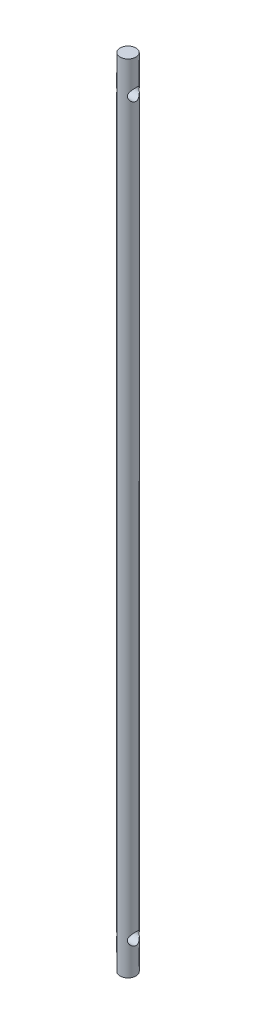
ISO-10303-21;
HEADER;
FILE_DESCRIPTION(('STEP AP214'),'2;1');
FILE_NAME('part.step','',(''),(''),'','','');
FILE_SCHEMA(('AUTOMOTIVE_DESIGN { 1 0 10303 214 1 1 1 1 }'));
ENDSEC;
DATA;
#1=APPLICATION_CONTEXT('core data for automotive mechanical design processes');
#2=APPLICATION_PROTOCOL_DEFINITION('international standard','automotive_design',2000,#1);
#3=PRODUCT_CONTEXT('',#1,'mechanical');
#4=PRODUCT('Part','Part','',(#3));
#5=PRODUCT_RELATED_PRODUCT_CATEGORY('part','',(#4));
#6=PRODUCT_DEFINITION_FORMATION('','',#4);
#7=PRODUCT_DEFINITION_CONTEXT('part definition',#1,'design');
#8=PRODUCT_DEFINITION('design','',#6,#7);
#9=PRODUCT_DEFINITION_SHAPE('','',#8);
#10=(LENGTH_UNIT() NAMED_UNIT(*) SI_UNIT(.MILLI.,.METRE.));
#11=(NAMED_UNIT(*) PLANE_ANGLE_UNIT() SI_UNIT($,.RADIAN.));
#12=(NAMED_UNIT(*) SI_UNIT($,.STERADIAN.) SOLID_ANGLE_UNIT());
#13=UNCERTAINTY_MEASURE_WITH_UNIT(LENGTH_MEASURE(1.E-05),#10,'distance_accuracy_value','');
#14=(GEOMETRIC_REPRESENTATION_CONTEXT(3) GLOBAL_UNCERTAINTY_ASSIGNED_CONTEXT((#13)) GLOBAL_UNIT_ASSIGNED_CONTEXT((#10,
#11,#12)) REPRESENTATION_CONTEXT('',''));
#15=CARTESIAN_POINT('',(0.,0.,0.));
#16=DIRECTION('',(0.,0.,1.));
#17=DIRECTION('',(1.,0.,0.));
#18=AXIS2_PLACEMENT_3D('',#15,#16,#17);
#19=CARTESIAN_POINT('',(0.,200.,0.));
#20=DIRECTION('',(0.,-1.,0.));
#21=DIRECTION('',(0.,0.,-1.));
#22=AXIS2_PLACEMENT_3D('',#19,#20,#21);
#23=CYLINDRICAL_SURFACE('',#22,2.);
#24=CARTESIAN_POINT('',(-1.32287565553229,8.1471500688628,-1.5));
#25=CARTESIAN_POINT('',(-1.32289190044095,8.21714749228843,-1.49999219049447));
#26=CARTESIAN_POINT('',(-1.32856366615416,8.28719590317471,-1.4950410907442));
#27=CARTESIAN_POINT('',(-1.34990644032801,8.42447992507228,-1.47578333210409));
#28=CARTESIAN_POINT('',(-1.3656072516867,8.4917065138823,-1.46144878565587));
#29=CARTESIAN_POINT('',(-1.4037512791687,8.62072991560117,-1.42483838991846));
#30=CARTESIAN_POINT('',(-1.42609848244814,8.68258884562526,-1.40267483444956));
#31=CARTESIAN_POINT('',(-1.47486455031267,8.80149552330799,-1.35130655299363));
#32=CARTESIAN_POINT('',(-1.50128292264932,8.85854385133201,-1.3221026780169));
#33=CARTESIAN_POINT('',(-1.56177312961146,8.97926286517939,-1.25039909811054));
#34=CARTESIAN_POINT('',(-1.59628904009787,9.04181800308927,-1.20639573950363));
#35=CARTESIAN_POINT('',(-1.66521164096378,9.15967553510506,-1.10933596759308));
#36=CARTESIAN_POINT('',(-1.69961809339876,9.21496703368307,-1.05626622282799));
#37=CARTESIAN_POINT('',(-1.7726258243625,9.32800880751826,-0.929610192252514));
#38=CARTESIAN_POINT('',(-1.81064921229758,9.38395603558265,-0.854047289142164));
#39=CARTESIAN_POINT('',(-1.87882809751632,9.48177227714563,-0.691189714821941));
#40=CARTESIAN_POINT('',(-1.90900204180106,9.52367436633161,-0.603923293836167));
#41=CARTESIAN_POINT('',(-1.95034258990248,9.58035775476574,-0.447869023983646));
#42=CARTESIAN_POINT('',(-1.96449710921006,9.59950716484126,-0.381446049692537));
#43=CARTESIAN_POINT('',(-1.98605635937555,9.62854018485954,-0.245552609316543));
#44=CARTESIAN_POINT('',(-1.99346695432364,9.63843184496954,-0.17608484599517));
#45=CARTESIAN_POINT('',(-2.00091375578086,9.64837180272529,-0.035865092622029));
#46=CARTESIAN_POINT('',(-2.00093080057495,9.64839452323923,0.0348897591186376));
#47=CARTESIAN_POINT('',(-1.99354206503066,9.63853213208251,0.175316156674035));
#48=CARTESIAN_POINT('',(-1.98613456571337,9.62864472595465,0.244987447822225));
#49=CARTESIAN_POINT('',(-1.96491377944411,9.60006901827293,0.37888919379265));
#50=CARTESIAN_POINT('',(-1.9513285776568,9.58169374247572,0.443224268236295));
#51=CARTESIAN_POINT('',(-1.91882278657017,9.53715442668056,0.567680485046396));
#52=CARTESIAN_POINT('',(-1.89990103394193,9.51098868834964,0.627800705033635));
#53=CARTESIAN_POINT('',(-1.85561045984504,9.44862045371748,0.749216921864729));
#54=CARTESIAN_POINT('',(-1.82976540608097,9.41163797224404,0.809935384713597));
#55=CARTESIAN_POINT('',(-1.77460702483739,9.33041636489228,0.924567250548283));
#56=CARTESIAN_POINT('',(-1.74529074780453,9.2861710551629,0.978474784621219));
#57=CARTESIAN_POINT('',(-1.6789376587236,9.18192672004186,1.08908204283329));
#58=CARTESIAN_POINT('',(-1.64151655866368,9.1205408588364,1.14424493004784));
#59=CARTESIAN_POINT('',(-1.56725958283769,8.98931548524085,1.24400875556228));
#60=CARTESIAN_POINT('',(-1.53042399363523,8.91947196933774,1.28860466211477));
#61=CARTESIAN_POINT('',(-1.46819425999159,8.78616819861717,1.358732064116));
#62=CARTESIAN_POINT('',(-1.44197599789983,8.72416302356215,1.38628866868102));
#63=CARTESIAN_POINT('',(-1.39536741257394,8.59508478744342,1.43319397108784));
#64=CARTESIAN_POINT('',(-1.37496395320511,8.52802358917243,1.45256121808259));
#65=CARTESIAN_POINT('',(-1.34640050620232,8.40346312486448,1.47902385350669));
#66=CARTESIAN_POINT('',(-1.3366153955687,8.34670298674594,1.48779069496581));
#67=CARTESIAN_POINT('',(-1.32435588438334,8.23179460268897,1.49871760619789));
#68=CARTESIAN_POINT('',(-1.32187213058307,8.17364822895998,1.50088612873265));
#69=CARTESIAN_POINT('',(-1.32462868790497,8.0576710771294,1.49845270115552));
#70=CARTESIAN_POINT('',(-1.32987184207164,7.99984042305313,1.4938482589949));
#71=CARTESIAN_POINT('',(-1.34721218775046,7.88607391641993,1.47822527271969));
#72=CARTESIAN_POINT('',(-1.35932107727345,7.8301414709147,1.46719578056394));
#73=CARTESIAN_POINT('',(-1.39427758287802,7.70081202392393,1.43413959562387));
#74=CARTESIAN_POINT('',(-1.41944823697315,7.62871411494777,1.40954189769242));
#75=CARTESIAN_POINT('',(-1.47537861079975,7.49084240522269,1.35088877838435));
#76=CARTESIAN_POINT('',(-1.50614858477229,7.42508055156805,1.31681594335477));
#77=CARTESIAN_POINT('',(-1.57108282375649,7.29780106081468,1.23869774116696));
#78=CARTESIAN_POINT('',(-1.60532883846045,7.23651719264455,1.19434110060342));
#79=CARTESIAN_POINT('',(-1.6734750627236,7.12114797250156,1.09682562914593));
#80=CARTESIAN_POINT('',(-1.70737509574664,7.06706614087387,1.04366252194464));
#81=CARTESIAN_POINT('',(-1.77960222623532,6.95587307723344,0.916234513829628));
#82=CARTESIAN_POINT('',(-1.81728174165356,6.90067483000521,0.839896270946864));
#83=CARTESIAN_POINT('',(-1.88453104769825,6.80452933541193,0.675551612651276));
#84=CARTESIAN_POINT('',(-1.91411836052283,6.76355124428151,0.58757102997486));
#85=CARTESIAN_POINT('',(-1.95419406402379,6.70871207741593,0.43075566149692));
#86=CARTESIAN_POINT('',(-1.96775478029639,6.69039327558736,0.364250057327482));
#87=CARTESIAN_POINT('',(-1.98810265589123,6.66302127255528,0.228364464964362));
#88=CARTESIAN_POINT('',(-1.9948958710696,6.65395978731429,0.158987104561953));
#89=CARTESIAN_POINT('',(-2.00113566717062,6.64563367793419,0.0191476059404086));
#90=CARTESIAN_POINT('',(-2.00056500218907,6.64639205151455,-0.0513166925870776));
#91=CARTESIAN_POINT('',(-1.9920880324381,6.65771106016403,-0.191009011030071));
#92=CARTESIAN_POINT('',(-1.98417977344351,6.66827430657027,-0.26023669659128));
#93=CARTESIAN_POINT('',(-1.96203400925195,6.69812498503003,-0.393521935254963));
#94=CARTESIAN_POINT('',(-1.94798690792879,6.71715025018434,-0.457671236511433));
#95=CARTESIAN_POINT('',(-1.91462720575136,6.76293813448173,-0.58166134309738));
#96=CARTESIAN_POINT('',(-1.89531347862386,6.78970240869371,-0.641501223388806));
#97=CARTESIAN_POINT('',(-1.85017642210641,6.85342800645876,-0.762547698766804));
#98=CARTESIAN_POINT('',(-1.82386352707581,6.89120100022238,-0.82314123671341));
#99=CARTESIAN_POINT('',(-1.76785506075717,6.974016509417,-0.937414811724206));
#100=CARTESIAN_POINT('',(-1.73815638795658,7.01906570614884,-0.991088412383366));
#101=CARTESIAN_POINT('',(-1.67106353042106,7.12515543542358,-1.1011238066068));
#102=CARTESIAN_POINT('',(-1.63330922504697,7.18759646830269,-1.15591691541995));
#103=CARTESIAN_POINT('',(-1.55866082463333,7.32101814076266,-1.25475253429349));
#104=CARTESIAN_POINT('',(-1.52176704921892,7.39200189489935,-1.29879110556728));
#105=CARTESIAN_POINT('',(-1.46049601449285,7.52603331945309,-1.36695971301454));
#106=CARTESIAN_POINT('',(-1.43513625007637,7.58748505156934,-1.39333526337998));
#107=CARTESIAN_POINT('',(-1.39032564651233,7.71523298191867,-1.43805398028599));
#108=CARTESIAN_POINT('',(-1.37085915899696,7.78151576045824,-1.45641847678344));
#109=CARTESIAN_POINT('',(-1.34532423383262,7.89793828845972,-1.4799705775638));
#110=CARTESIAN_POINT('',(-1.33700130265679,7.94711714015325,-1.48744249026866));
#111=CARTESIAN_POINT('',(-1.32577295392454,8.04657240189645,-1.49745839072448));
#112=CARTESIAN_POINT('',(-1.32286398151145,8.09684806980652,-1.50000561211714));
#113=CARTESIAN_POINT('',(-1.32287565553229,8.1471500688628,-1.5));
#114=B_SPLINE_CURVE_WITH_KNOTS('',3,(#24,#25,#26,#27,#28,#29,#30,#31,#32,#33,#34,#35,#36,#37,
#38,#39,#40,#41,#42,#43,#44,#45,#46,#47,#48,#49,#50,#51,#52,#53,#54,#55,#56,#57,#58,#59,#60,#61,
#62,#63,#64,#65,#66,#67,#68,#69,#70,#71,#72,#73,#74,#75,#76,#77,#78,#79,#80,#81,#82,#83,#84,#85,
#86,#87,#88,#89,#90,#91,#92,#93,#94,#95,#96,#97,#98,#99,#100,#101,#102,#103,#104,#105,#106,#107,
#108,#109,#110,#111,#112,#113),.UNSPECIFIED.,.T.,.F.,(4,2,2,2,2,2,2,2,2,2,2,2,2,2,2,2,2,2,2,2,2,
2,2,2,2,2,2,2,2,2,2,2,2,2,2,2,2,2,2,2,2,2,2,2,4),(0.,0.20973177668449,0.420089722582993,
0.627545385620137,0.834975984672343,1.08585208691169,1.33710031031849,1.63964848103538,
1.94147907444963,2.15227725277555,2.36289195870711,2.57405250727806,2.78526195641288,
2.9892375589505,3.19325766108669,3.41936844116895,3.64567274887663,3.91649517204702,
4.18744629647933,4.40499409477196,4.62204646613005,4.79608005545901,4.96989060538192,
5.14376512326212,5.31793678696019,5.55730028202397,5.7971066263915,6.04543209090059,
6.29387849446617,6.59652499511462,6.89851088586564,7.10852896194426,7.3183589353918,
7.52868041101042,7.73905791773944,7.94332812691911,8.14764205379332,8.37510052489609,
8.60276905744643,8.87547580578153,9.14828228208529,9.36218279640834,9.57551025772698,
9.72632812073766,9.87704692032409),.UNSPECIFIED.);
#115=CARTESIAN_POINT('',(-1.32287565553229,8.1471500688628,-1.5));
#116=VERTEX_POINT('',#115);
#117=EDGE_CURVE('E41',#116,#116,#114,.T.);
#118=ORIENTED_EDGE('',*,*,#117,.T.);
#119=EDGE_LOOP('',(#118));
#120=FACE_BOUND('',#119,.T.);
#121=CARTESIAN_POINT('',(1.32287565553229,8.1471500688628,-1.5));
#122=CARTESIAN_POINT('',(1.32289190044095,8.07715264543717,-1.49999219049447));
#123=CARTESIAN_POINT('',(1.32856366615416,8.00710423455088,-1.4950410907442));
#124=CARTESIAN_POINT('',(1.34990644032801,7.86982021265332,-1.47578333210409));
#125=CARTESIAN_POINT('',(1.3656072516867,7.80259362384329,-1.46144878565587));
#126=CARTESIAN_POINT('',(1.4037512791687,7.67357022212442,-1.42483838991846));
#127=CARTESIAN_POINT('',(1.42609848244814,7.61171129210033,-1.40267483444956));
#128=CARTESIAN_POINT('',(1.47486455031267,7.4928046144176,-1.35130655299363));
#129=CARTESIAN_POINT('',(1.50128292264932,7.43575628639358,-1.3221026780169));
#130=CARTESIAN_POINT('',(1.56177312961146,7.3150372725462,-1.25039909811054));
#131=CARTESIAN_POINT('',(1.59628904009787,7.25248213463632,-1.20639573950363));
#132=CARTESIAN_POINT('',(1.66521164096378,7.13462460262053,-1.10933596759308));
#133=CARTESIAN_POINT('',(1.69961809339876,7.07933310404252,-1.05626622282799));
#134=CARTESIAN_POINT('',(1.7726258243625,6.96629133020733,-0.929610192252514));
#135=CARTESIAN_POINT('',(1.81064921229758,6.91034410214294,-0.854047289142163));
#136=CARTESIAN_POINT('',(1.87882809751632,6.81252786057996,-0.69118971482194));
#137=CARTESIAN_POINT('',(1.90900204180106,6.77062577139398,-0.603923293836166));
#138=CARTESIAN_POINT('',(1.95034258990248,6.71394238295985,-0.447869023983645));
#139=CARTESIAN_POINT('',(1.96449710921006,6.69479297288433,-0.381446049692536));
#140=CARTESIAN_POINT('',(1.98605635937555,6.66575995286605,-0.245552609316542));
#141=CARTESIAN_POINT('',(1.99346695432364,6.65586829275606,-0.176084845995169));
#142=CARTESIAN_POINT('',(2.00091375578086,6.6459283350003,-0.0358650926220274));
#143=CARTESIAN_POINT('',(2.00093080057495,6.64590561448636,0.0348897591186391));
#144=CARTESIAN_POINT('',(1.99354206503066,6.65576800564308,0.175316156674036));
#145=CARTESIAN_POINT('',(1.98613456571337,6.66565541177094,0.244987447822227));
#146=CARTESIAN_POINT('',(1.96491377944411,6.69423111945266,0.378889193792651));
#147=CARTESIAN_POINT('',(1.9513285776568,6.71260639524987,0.443224268236296));
#148=CARTESIAN_POINT('',(1.91882278657017,6.75714571104503,0.567680485046397));
#149=CARTESIAN_POINT('',(1.89990103394193,6.78331144937596,0.627800705033636));
#150=CARTESIAN_POINT('',(1.85561045984504,6.84567968400811,0.749216921864729));
#151=CARTESIAN_POINT('',(1.82976540608097,6.88266216548156,0.809935384713597));
#152=CARTESIAN_POINT('',(1.77460702483739,6.96388377283331,0.924567250548283));
#153=CARTESIAN_POINT('',(1.74529074780453,7.00812908256269,0.97847478462122));
#154=CARTESIAN_POINT('',(1.6789376587236,7.11237341768374,1.08908204283329));
#155=CARTESIAN_POINT('',(1.64151655866368,7.17375927888919,1.14424493004784));
#156=CARTESIAN_POINT('',(1.56725958283769,7.30498465248474,1.24400875556228));
#157=CARTESIAN_POINT('',(1.53042399363523,7.37482816838786,1.28860466211477));
#158=CARTESIAN_POINT('',(1.46819425999159,7.50813193910842,1.358732064116));
#159=CARTESIAN_POINT('',(1.44197599789983,7.57013711416345,1.38628866868102));
#160=CARTESIAN_POINT('',(1.39536741257394,7.69921535028218,1.43319397108784));
#161=CARTESIAN_POINT('',(1.37496395320511,7.76627654855316,1.45256121808259));
#162=CARTESIAN_POINT('',(1.34640050620232,7.89083701286112,1.47902385350669));
#163=CARTESIAN_POINT('',(1.3366153955687,7.94759715097966,1.48779069496582));
#164=CARTESIAN_POINT('',(1.32435588438334,8.06250553503662,1.49871760619789));
#165=CARTESIAN_POINT('',(1.32187213058307,8.12065190876562,1.50088612873265));
#166=CARTESIAN_POINT('',(1.32462868790497,8.23662906059619,1.49845270115552));
#167=CARTESIAN_POINT('',(1.32987184207164,8.29445971467247,1.4938482589949));
#168=CARTESIAN_POINT('',(1.34721218775046,8.40822622130566,1.47822527271969));
#169=CARTESIAN_POINT('',(1.35932107727345,8.4641586668109,1.46719578056394));
#170=CARTESIAN_POINT('',(1.39427758287802,8.59348811380166,1.43413959562387));
#171=CARTESIAN_POINT('',(1.41944823697315,8.66558602277782,1.40954189769242));
#172=CARTESIAN_POINT('',(1.47537861079975,8.80345773250291,1.35088877838435));
#173=CARTESIAN_POINT('',(1.5061485847723,8.86921958615754,1.31681594335477));
#174=CARTESIAN_POINT('',(1.57108282375649,8.99649907691091,1.23869774116696));
#175=CARTESIAN_POINT('',(1.60532883846045,9.05778294508105,1.19434110060341));
#176=CARTESIAN_POINT('',(1.67347506272361,9.17315216522404,1.09682562914592));
#177=CARTESIAN_POINT('',(1.70737509574665,9.22723399685173,1.04366252194464));
#178=CARTESIAN_POINT('',(1.77960222623532,9.33842706049216,0.916234513829624));
#179=CARTESIAN_POINT('',(1.81728174165356,9.39362530772039,0.839896270946859));
#180=CARTESIAN_POINT('',(1.88453104769825,9.48977080231367,0.67555161265127));
#181=CARTESIAN_POINT('',(1.91411836052283,9.53074889344409,0.587571029974854));
#182=CARTESIAN_POINT('',(1.95419406402379,9.58558806030966,0.430755661496913));
#183=CARTESIAN_POINT('',(1.96775478029639,9.60390686213823,0.364250057327474));
#184=CARTESIAN_POINT('',(1.98810265589123,9.63127886517032,0.228364464964354));
#185=CARTESIAN_POINT('',(1.9948958710696,9.64034035041131,0.158987104561945));
#186=CARTESIAN_POINT('',(2.00113566717062,9.6486664597914,0.0191476059404014));
#187=CARTESIAN_POINT('',(2.00056500218907,9.64790808621104,-0.0513166925870849));
#188=CARTESIAN_POINT('',(1.9920880324381,9.63658907756156,-0.191009011030078));
#189=CARTESIAN_POINT('',(1.98417977344351,9.62602583115532,-0.260236696591286));
#190=CARTESIAN_POINT('',(1.96203400925195,9.59617515269556,-0.39352193525497));
#191=CARTESIAN_POINT('',(1.94798690792879,9.57714988754125,-0.45767123651144));
#192=CARTESIAN_POINT('',(1.91462720575136,9.53136200324386,-0.581661343097387));
#193=CARTESIAN_POINT('',(1.89531347862386,9.50459772903188,-0.641501223388813));
#194=CARTESIAN_POINT('',(1.8501764221064,9.44087213126683,-0.76254769876681));
#195=CARTESIAN_POINT('',(1.82386352707581,9.40309913750321,-0.823141236713415));
#196=CARTESIAN_POINT('',(1.76785506075717,9.32028362830858,-0.937414811724212));
#197=CARTESIAN_POINT('',(1.73815638795658,9.27523443157675,-0.991088412383371));
#198=CARTESIAN_POINT('',(1.67106353042106,9.16914470230201,-1.10112380660681));
#199=CARTESIAN_POINT('',(1.63330922504697,9.1067036694229,-1.15591691541995));
#200=CARTESIAN_POINT('',(1.55866082463332,8.97328199696292,-1.2547525342935));
#201=CARTESIAN_POINT('',(1.52176704921892,8.90229824282623,-1.29879110556728));
#202=CARTESIAN_POINT('',(1.46049601449284,8.76826681827249,-1.36695971301455));
#203=CARTESIAN_POINT('',(1.43513625007637,8.70681508615624,-1.39333526337998));
#204=CARTESIAN_POINT('',(1.39032564651232,8.57906715580692,-1.43805398028599));
#205=CARTESIAN_POINT('',(1.37085915899696,8.51278437726735,-1.45641847678344));
#206=CARTESIAN_POINT('',(1.34532423383262,8.39636184926587,-1.4799705775638));
#207=CARTESIAN_POINT('',(1.33700130265679,8.34718299757233,-1.48744249026866));
#208=CARTESIAN_POINT('',(1.32577295392454,8.24772773582914,-1.49745839072448));
#209=CARTESIAN_POINT('',(1.32286398151145,8.19745206791907,-1.50000561211714));
#210=CARTESIAN_POINT('',(1.32287565553229,8.1471500688628,-1.5));
#211=B_SPLINE_CURVE_WITH_KNOTS('',3,(#121,#122,#123,#124,#125,#126,#127,#128,#129,#130,#131,
#132,#133,#134,#135,#136,#137,#138,#139,#140,#141,#142,#143,#144,#145,#146,#147,#148,#149,#150,
#151,#152,#153,#154,#155,#156,#157,#158,#159,#160,#161,#162,#163,#164,#165,#166,#167,#168,#169,
#170,#171,#172,#173,#174,#175,#176,#177,#178,#179,#180,#181,#182,#183,#184,#185,#186,#187,#188,
#189,#190,#191,#192,#193,#194,#195,#196,#197,#198,#199,#200,#201,#202,#203,#204,#205,#206,#207,
#208,#209,#210),.UNSPECIFIED.,.T.,.F.,(4,2,2,2,2,2,2,2,2,2,2,2,2,2,2,2,2,2,2,2,2,2,2,2,2,2,2,2,
2,2,2,2,2,2,2,2,2,2,2,2,2,2,2,2,4),(0.,0.20973177668449,0.420089722582994,0.62754538562014,
0.834975984672345,1.08585208691169,1.33710031031849,1.63964848103538,1.94147907444963,
2.15227725277555,2.36289195870711,2.57405250727807,2.78526195641288,2.9892375589505,
3.19325766108669,3.41936844116895,3.64567274887663,3.91649517204702,4.18744629647933,
4.40499409477196,4.62204646613006,4.79608005545901,4.96989060538193,5.14376512326213,
5.31793678696019,5.55730028202397,5.79710662639151,6.0454320909006,6.29387849446617,
6.59652499511462,6.89851088586565,7.10852896194426,7.3183589353918,7.52868041101043,
7.73905791773944,7.94332812691912,8.14764205379332,8.3751005248961,8.60276905744644,
8.87547580578154,9.1482822820853,9.36218279640835,9.57551025772699,9.72632812073766,
9.87704692032409),.UNSPECIFIED.);
#212=CARTESIAN_POINT('',(1.32287565553229,8.1471500688628,-1.5));
#213=VERTEX_POINT('',#212);
#214=EDGE_CURVE('E96',#213,#213,#211,.T.);
#215=ORIENTED_EDGE('',*,*,#214,.T.);
#216=EDGE_LOOP('',(#215));
#217=FACE_BOUND('',#216,.T.);
#218=CARTESIAN_POINT('',(-1.32287565553229,191.852849931137,-1.5));
#219=CARTESIAN_POINT('',(-1.32289190044095,191.922847354563,-1.49999219049448));
#220=CARTESIAN_POINT('',(-1.32856366615416,191.992895765449,-1.4950410907442));
#221=CARTESIAN_POINT('',(-1.349906440328,192.130179787347,-1.4757833321041));
#222=CARTESIAN_POINT('',(-1.36560725168669,192.197406376157,-1.46144878565588));
#223=CARTESIAN_POINT('',(-1.4037512791687,192.326429777876,-1.42483838991847));
#224=CARTESIAN_POINT('',(-1.42609848244814,192.3882887079,-1.40267483444956));
#225=CARTESIAN_POINT('',(-1.47486455031267,192.507195385582,-1.35130655299364));
#226=CARTESIAN_POINT('',(-1.50128292264931,192.564243713606,-1.32210267801691));
#227=CARTESIAN_POINT('',(-1.56177312961147,192.684962727454,-1.25039909811054));
#228=CARTESIAN_POINT('',(-1.59628904009787,192.747517865364,-1.20639573950363));
#229=CARTESIAN_POINT('',(-1.66521164096379,192.865375397379,-1.10933596759307));
#230=CARTESIAN_POINT('',(-1.69961809339876,192.920666895957,-1.05626622282799));
#231=CARTESIAN_POINT('',(-1.7726258243625,193.033708669793,-0.929610192252514));
#232=CARTESIAN_POINT('',(-1.81064921229758,193.089655897857,-0.854047289142167));
#233=CARTESIAN_POINT('',(-1.87882809751631,193.18747213942,-0.691189714821954));
#234=CARTESIAN_POINT('',(-1.90900204180105,193.229374228606,-0.603923293836189));
#235=CARTESIAN_POINT('',(-1.95034258990247,193.28605761704,-0.44786902398368));
#236=CARTESIAN_POINT('',(-1.96449710921005,193.305207027116,-0.381446049692573));
#237=CARTESIAN_POINT('',(-1.98605635937554,193.334240047134,-0.245552609316582));
#238=CARTESIAN_POINT('',(-1.99346695432363,193.344131707244,-0.17608484599521));
#239=CARTESIAN_POINT('',(-2.00091375578086,193.354071665,-0.0358650926220673));
#240=CARTESIAN_POINT('',(-2.00093080057495,193.354094385514,0.0348897591186004));
#241=CARTESIAN_POINT('',(-1.99354206503066,193.344231994357,0.175316156673999));
#242=CARTESIAN_POINT('',(-1.98613456571338,193.334344588229,0.244987447822189));
#243=CARTESIAN_POINT('',(-1.96491377944412,193.305768880547,0.378889193792616));
#244=CARTESIAN_POINT('',(-1.95132857765681,193.28739360475,0.443224268236262));
#245=CARTESIAN_POINT('',(-1.91882278657017,193.242854288955,0.567680485046366));
#246=CARTESIAN_POINT('',(-1.89990103394194,193.216688550624,0.627800705033606));
#247=CARTESIAN_POINT('',(-1.85561045984505,193.154320315992,0.749216921864705));
#248=CARTESIAN_POINT('',(-1.82976540608098,193.117337834518,0.809935384713577));
#249=CARTESIAN_POINT('',(-1.7746070248374,193.036116227167,0.924567250548262));
#250=CARTESIAN_POINT('',(-1.74529074780455,192.991870917437,0.978474784621196));
#251=CARTESIAN_POINT('',(-1.67893765872361,192.887626582316,1.08908204283326));
#252=CARTESIAN_POINT('',(-1.64151655866369,192.826240721111,1.14424493004782));
#253=CARTESIAN_POINT('',(-1.56725958283771,192.695015347515,1.24400875556225));
#254=CARTESIAN_POINT('',(-1.53042399363526,192.625171831612,1.28860466211474));
#255=CARTESIAN_POINT('',(-1.46819425999161,192.491868060892,1.35873206411598));
#256=CARTESIAN_POINT('',(-1.44197599789984,192.429862885837,1.38628866868101));
#257=CARTESIAN_POINT('',(-1.39536741257394,192.300784649718,1.43319397108784));
#258=CARTESIAN_POINT('',(-1.37496395320511,192.233723451447,1.45256121808258));
#259=CARTESIAN_POINT('',(-1.34640050620232,192.109162987139,1.47902385350669));
#260=CARTESIAN_POINT('',(-1.3366153955687,192.05240284902,1.48779069496582));
#261=CARTESIAN_POINT('',(-1.32435588438333,191.937494464963,1.49871760619789));
#262=CARTESIAN_POINT('',(-1.32187213058307,191.879348091234,1.50088612873266));
#263=CARTESIAN_POINT('',(-1.32462868790497,191.763370939404,1.49845270115552));
#264=CARTESIAN_POINT('',(-1.32987184207164,191.705540285328,1.4938482589949));
#265=CARTESIAN_POINT('',(-1.34721218775046,191.591773778694,1.4782252727197));
#266=CARTESIAN_POINT('',(-1.35932107727345,191.535841333189,1.46719578056394));
#267=CARTESIAN_POINT('',(-1.39427758287801,191.406511886198,1.43413959562387));
#268=CARTESIAN_POINT('',(-1.41944823697314,191.334413977222,1.40954189769242));
#269=CARTESIAN_POINT('',(-1.47537861079974,191.196542267497,1.35088877838436));
#270=CARTESIAN_POINT('',(-1.50614858477229,191.130780413843,1.31681594335478));
#271=CARTESIAN_POINT('',(-1.57108282375649,191.003500923089,1.23869774116697));
#272=CARTESIAN_POINT('',(-1.60532883846045,190.942217054919,1.19434110060342));
#273=CARTESIAN_POINT('',(-1.6734750627236,190.826847834776,1.09682562914593));
#274=CARTESIAN_POINT('',(-1.70737509574664,190.772766003148,1.04366252194465));
#275=CARTESIAN_POINT('',(-1.77960222623531,190.661572939508,0.916234513829644));
#276=CARTESIAN_POINT('',(-1.81728174165355,190.60637469228,0.839896270946888));
#277=CARTESIAN_POINT('',(-1.88453104769824,190.510229197686,0.675551612651306));
#278=CARTESIAN_POINT('',(-1.91411836052282,190.469251106556,0.587571029974888));
#279=CARTESIAN_POINT('',(-1.95419406402378,190.41441193969,0.43075566149695));
#280=CARTESIAN_POINT('',(-1.96775478029639,190.396093137862,0.364250057327512));
#281=CARTESIAN_POINT('',(-1.98810265589122,190.36872113483,0.228364464964391));
#282=CARTESIAN_POINT('',(-1.99489587106959,190.359659649589,0.158987104561982));
#283=CARTESIAN_POINT('',(-2.00113566717062,190.351333540209,0.0191476059404341));
#284=CARTESIAN_POINT('',(-2.00056500218907,190.352091913789,-0.0513166925870554));
#285=CARTESIAN_POINT('',(-1.9920880324381,190.363410922438,-0.191009011030052));
#286=CARTESIAN_POINT('',(-1.98417977344351,190.373974168845,-0.26023669659126));
#287=CARTESIAN_POINT('',(-1.96203400925195,190.403824847304,-0.39352193525495));
#288=CARTESIAN_POINT('',(-1.94798690792879,190.422850112459,-0.457671236511427));
#289=CARTESIAN_POINT('',(-1.91462720575137,190.468637996756,-0.581661343097373));
#290=CARTESIAN_POINT('',(-1.89531347862387,190.495402270968,-0.641501223388791));
#291=CARTESIAN_POINT('',(-1.85017642210641,190.559127868733,-0.762547698766783));
#292=CARTESIAN_POINT('',(-1.82386352707582,190.596900862497,-0.82314123671339));
#293=CARTESIAN_POINT('',(-1.76785506075718,190.679716371691,-0.937414811724189));
#294=CARTESIAN_POINT('',(-1.73815638795659,190.724765568423,-0.991088412383349));
#295=CARTESIAN_POINT('',(-1.67106353042108,190.830855297698,-1.10112380660678));
#296=CARTESIAN_POINT('',(-1.63330922504699,190.893296330577,-1.15591691541992));
#297=CARTESIAN_POINT('',(-1.55866082463334,191.026718003037,-1.25475253429347));
#298=CARTESIAN_POINT('',(-1.52176704921894,191.097701757174,-1.29879110556726));
#299=CARTESIAN_POINT('',(-1.46049601449286,191.231733181727,-1.36695971301453));
#300=CARTESIAN_POINT('',(-1.43513625007638,191.293184913844,-1.39333526337996));
#301=CARTESIAN_POINT('',(-1.39032564651234,191.420932844193,-1.43805398028598));
#302=CARTESIAN_POINT('',(-1.37085915899697,191.487215622733,-1.45641847678343));
#303=CARTESIAN_POINT('',(-1.34532423383262,191.603638150734,-1.4799705775638));
#304=CARTESIAN_POINT('',(-1.33700130265679,191.652817002428,-1.48744249026866));
#305=CARTESIAN_POINT('',(-1.32577295392454,191.752272264171,-1.49745839072448));
#306=CARTESIAN_POINT('',(-1.32286398151145,191.802547932081,-1.50000561211714));
#307=CARTESIAN_POINT('',(-1.32287565553229,191.852849931137,-1.5));
#308=B_SPLINE_CURVE_WITH_KNOTS('',3,(#218,#219,#220,#221,#222,#223,#224,#225,#226,#227,#228,
#229,#230,#231,#232,#233,#234,#235,#236,#237,#238,#239,#240,#241,#242,#243,#244,#245,#246,#247,
#248,#249,#250,#251,#252,#253,#254,#255,#256,#257,#258,#259,#260,#261,#262,#263,#264,#265,#266,
#267,#268,#269,#270,#271,#272,#273,#274,#275,#276,#277,#278,#279,#280,#281,#282,#283,#284,#285,
#286,#287,#288,#289,#290,#291,#292,#293,#294,#295,#296,#297,#298,#299,#300,#301,#302,#303,#304,
#305,#306,#307),.UNSPECIFIED.,.T.,.F.,(4,2,2,2,2,2,2,2,2,2,2,2,2,2,2,2,2,2,2,2,2,2,2,2,2,2,2,2,
2,2,2,2,2,2,2,2,2,2,2,2,2,2,2,2,4),(0.,0.209731776684434,0.420089722582982,0.627545385620124,
0.834975984672333,1.0858520869117,1.3371003103185,1.63964848103538,1.94147907444959,
2.15227725277551,2.36289195870707,2.57405250727803,2.78526195641284,2.98923755895046,
3.19325766108666,3.41936844116892,3.6456727488766,3.91649517204696,4.18744629647928,
4.40499409477192,4.62204646613006,4.796080055459,4.96989060538193,5.14376512326209,
5.31793678696017,5.55730028202393,5.79710662639149,6.04543209090057,6.29387849446614,
6.59652499511458,6.8985108858656,7.10852896194422,7.31835893539176,7.5286804110104,
7.73905791773941,7.9433281269191,8.14764205379329,8.37510052489605,8.60276905744641,
8.87547580578148,9.14828228208525,9.36218279640829,9.57551025772694,9.72632812073766,
9.87704692032409),.UNSPECIFIED.);
#309=CARTESIAN_POINT('',(-1.32287565553229,191.852849931137,-1.5));
#310=VERTEX_POINT('',#309);
#311=EDGE_CURVE('E66',#310,#310,#308,.T.);
#312=ORIENTED_EDGE('',*,*,#311,.T.);
#313=EDGE_LOOP('',(#312));
#314=FACE_BOUND('',#313,.T.);
#315=CARTESIAN_POINT('',(1.32287565553229,191.852849931137,-1.5));
#316=CARTESIAN_POINT('',(1.32289190044095,191.782852507712,-1.49999219049448));
#317=CARTESIAN_POINT('',(1.32856366615416,191.712804096825,-1.4950410907442));
#318=CARTESIAN_POINT('',(1.34990644032801,191.575520074928,-1.47578333210409));
#319=CARTESIAN_POINT('',(1.3656072516867,191.508293486118,-1.46144878565588));
#320=CARTESIAN_POINT('',(1.4037512791687,191.379270084399,-1.42483838991847));
#321=CARTESIAN_POINT('',(1.42609848244814,191.317411154375,-1.40267483444956));
#322=CARTESIAN_POINT('',(1.47486455031267,191.198504476692,-1.35130655299364));
#323=CARTESIAN_POINT('',(1.50128292264931,191.141456148668,-1.32210267801691));
#324=CARTESIAN_POINT('',(1.56177312961147,191.020737134821,-1.25039909811054));
#325=CARTESIAN_POINT('',(1.59628904009787,190.958181996911,-1.20639573950363));
#326=CARTESIAN_POINT('',(1.66521164096379,190.840324464895,-1.10933596759307));
#327=CARTESIAN_POINT('',(1.69961809339876,190.785032966317,-1.05626622282799));
#328=CARTESIAN_POINT('',(1.7726258243625,190.671991192482,-0.929610192252517));
#329=CARTESIAN_POINT('',(1.81064921229758,190.616043964417,-0.85404728914217));
#330=CARTESIAN_POINT('',(1.87882809751631,190.518227722854,-0.691189714821959));
#331=CARTESIAN_POINT('',(1.90900204180105,190.476325633668,-0.603923293836194));
#332=CARTESIAN_POINT('',(1.95034258990247,190.419642245234,-0.447869023983681));
#333=CARTESIAN_POINT('',(1.96449710921005,190.400492835159,-0.381446049692574));
#334=CARTESIAN_POINT('',(1.98605635937554,190.37145981514,-0.245552609316582));
#335=CARTESIAN_POINT('',(1.99346695432363,190.361568155031,-0.17608484599521));
#336=CARTESIAN_POINT('',(2.00091375578086,190.351628197275,-0.0358650926220673));
#337=CARTESIAN_POINT('',(2.00093080057495,190.351605476761,0.0348897591186004));
#338=CARTESIAN_POINT('',(1.99354206503066,190.361467867917,0.175316156673999));
#339=CARTESIAN_POINT('',(1.98613456571338,190.371355274045,0.244987447822189));
#340=CARTESIAN_POINT('',(1.96491377944412,190.399930981727,0.378889193792616));
#341=CARTESIAN_POINT('',(1.95132857765681,190.418306257524,0.443224268236262));
#342=CARTESIAN_POINT('',(1.91882278657017,190.462845573319,0.567680485046366));
#343=CARTESIAN_POINT('',(1.89990103394194,190.48901131165,0.627800705033606));
#344=CARTESIAN_POINT('',(1.85561045984505,190.551379546283,0.749216921864705));
#345=CARTESIAN_POINT('',(1.82976540608098,190.588362027756,0.809935384713577));
#346=CARTESIAN_POINT('',(1.7746070248374,190.669583635108,0.924567250548262));
#347=CARTESIAN_POINT('',(1.74529074780455,190.713828944837,0.978474784621196));
#348=CARTESIAN_POINT('',(1.67893765872361,190.818073279958,1.08908204283326));
#349=CARTESIAN_POINT('',(1.64151655866369,190.879459141164,1.14424493004782));
#350=CARTESIAN_POINT('',(1.56725958283771,191.010684514759,1.24400875556225));
#351=CARTESIAN_POINT('',(1.53042399363526,191.080528030662,1.28860466211474));
#352=CARTESIAN_POINT('',(1.46819425999161,191.213831801383,1.35873206411598));
#353=CARTESIAN_POINT('',(1.44197599789984,191.275836976438,1.38628866868101));
#354=CARTESIAN_POINT('',(1.39536741257394,191.404915212557,1.43319397108784));
#355=CARTESIAN_POINT('',(1.37496395320511,191.471976410828,1.45256121808258));
#356=CARTESIAN_POINT('',(1.34640050620232,191.596536875136,1.47902385350669));
#357=CARTESIAN_POINT('',(1.3366153955687,191.653297013254,1.48779069496581));
#358=CARTESIAN_POINT('',(1.32435588438334,191.768205397311,1.49871760619789));
#359=CARTESIAN_POINT('',(1.32187213058307,191.82635177104,1.50088612873266));
#360=CARTESIAN_POINT('',(1.32462868790497,191.942328922871,1.49845270115552));
#361=CARTESIAN_POINT('',(1.32987184207164,192.000159576947,1.4938482589949));
#362=CARTESIAN_POINT('',(1.34721218775046,192.11392608358,1.4782252727197));
#363=CARTESIAN_POINT('',(1.35932107727345,192.169858529085,1.46719578056394));
#364=CARTESIAN_POINT('',(1.39427758287801,192.299187976076,1.43413959562387));
#365=CARTESIAN_POINT('',(1.41944823697314,192.371285885052,1.40954189769242));
#366=CARTESIAN_POINT('',(1.47537861079974,192.509157594777,1.35088877838436));
#367=CARTESIAN_POINT('',(1.50614858477229,192.574919448432,1.31681594335478));
#368=CARTESIAN_POINT('',(1.57108282375649,192.702198939185,1.23869774116697));
#369=CARTESIAN_POINT('',(1.60532883846045,192.763482807355,1.19434110060342));
#370=CARTESIAN_POINT('',(1.6734750627236,192.878852027498,1.09682562914593));
#371=CARTESIAN_POINT('',(1.70737509574664,192.932933859126,1.04366252194465));
#372=CARTESIAN_POINT('',(1.77960222623531,193.044126922767,0.916234513829644));
#373=CARTESIAN_POINT('',(1.81728174165355,193.099325169995,0.839896270946888));
#374=CARTESIAN_POINT('',(1.88453104769824,193.195470664588,0.675551612651306));
#375=CARTESIAN_POINT('',(1.91411836052282,193.236448755718,0.587571029974888));
#376=CARTESIAN_POINT('',(1.95419406402378,193.291287922584,0.43075566149695));
#377=CARTESIAN_POINT('',(1.96775478029639,193.309606724413,0.364250057327512));
#378=CARTESIAN_POINT('',(1.98810265589122,193.336978727445,0.228364464964391));
#379=CARTESIAN_POINT('',(1.99489587106959,193.346040212686,0.158987104561982));
#380=CARTESIAN_POINT('',(2.00113566717062,193.354366322066,0.0191476059404356));
#381=CARTESIAN_POINT('',(2.00056500218907,193.353607948485,-0.0513166925870523));
#382=CARTESIAN_POINT('',(1.9920880324381,193.342288939836,-0.191009011030049));
#383=CARTESIAN_POINT('',(1.98417977344351,193.33172569343,-0.260236696591259));
#384=CARTESIAN_POINT('',(1.96203400925195,193.30187501497,-0.393521935254947));
#385=CARTESIAN_POINT('',(1.94798690792879,193.282849749816,-0.45767123651142));
#386=CARTESIAN_POINT('',(1.91462720575137,193.237061865518,-0.581661343097367));
#387=CARTESIAN_POINT('',(1.89531347862387,193.210297591306,-0.641501223388789));
#388=CARTESIAN_POINT('',(1.85017642210641,193.146571993541,-0.762547698766783));
#389=CARTESIAN_POINT('',(1.82386352707582,193.108798999778,-0.82314123671339));
#390=CARTESIAN_POINT('',(1.76785506075718,193.025983490583,-0.937414811724189));
#391=CARTESIAN_POINT('',(1.73815638795659,192.980934293851,-0.991088412383349));
#392=CARTESIAN_POINT('',(1.67106353042108,192.874844564576,-1.10112380660678));
#393=CARTESIAN_POINT('',(1.63330922504699,192.812403531697,-1.15591691541992));
#394=CARTESIAN_POINT('',(1.55866082463334,192.678981859237,-1.25475253429347));
#395=CARTESIAN_POINT('',(1.52176704921894,192.607998105101,-1.29879110556726));
#396=CARTESIAN_POINT('',(1.46049601449286,192.473966680547,-1.36695971301453));
#397=CARTESIAN_POINT('',(1.43513625007638,192.412514948431,-1.39333526337996));
#398=CARTESIAN_POINT('',(1.39032564651234,192.284767018081,-1.43805398028598));
#399=CARTESIAN_POINT('',(1.37085915899697,192.218484239542,-1.45641847678343));
#400=CARTESIAN_POINT('',(1.34532423383262,192.10206171154,-1.4799705775638));
#401=CARTESIAN_POINT('',(1.33700130265679,192.052882859847,-1.48744249026866));
#402=CARTESIAN_POINT('',(1.32577295392454,191.953427598104,-1.49745839072448));
#403=CARTESIAN_POINT('',(1.32286398151145,191.903151930194,-1.50000561211714));
#404=CARTESIAN_POINT('',(1.32287565553229,191.852849931137,-1.5));
#405=B_SPLINE_CURVE_WITH_KNOTS('',3,(#315,#316,#317,#318,#319,#320,#321,#322,#323,#324,#325,
#326,#327,#328,#329,#330,#331,#332,#333,#334,#335,#336,#337,#338,#339,#340,#341,#342,#343,#344,
#345,#346,#347,#348,#349,#350,#351,#352,#353,#354,#355,#356,#357,#358,#359,#360,#361,#362,#363,
#364,#365,#366,#367,#368,#369,#370,#371,#372,#373,#374,#375,#376,#377,#378,#379,#380,#381,#382,
#383,#384,#385,#386,#387,#388,#389,#390,#391,#392,#393,#394,#395,#396,#397,#398,#399,#400,#401,
#402,#403,#404),.UNSPECIFIED.,.T.,.F.,(4,2,2,2,2,2,2,2,2,2,2,2,2,2,2,2,2,2,2,2,2,2,2,2,2,2,2,2,
2,2,2,2,2,2,2,2,2,2,2,2,2,2,2,2,4),(0.,0.209731776684462,0.420089722582982,0.627545385620124,
0.834975984672333,1.0858520869117,1.3371003103185,1.63964848103535,1.94147907444959,
2.15227725277551,2.36289195870706,2.57405250727802,2.78526195641284,2.98923755895046,
3.19325766108665,3.41936844116892,3.64567274887659,3.91649517204696,4.18744629647928,
4.40499409477192,4.62204646613005,4.79608005545897,4.96989060538193,5.14376512326209,
5.31793678696017,5.55730028202393,5.79710662639148,6.04543209090057,6.29387849446613,
6.59652499511458,6.89851088586559,7.10852896194422,7.31835893539176,7.52868041101039,
7.73905791773941,7.94332812691909,8.14764205379329,8.37510052489605,8.6027690574464,
8.87547580578148,9.14828228208525,9.36218279640829,9.57551025772694,9.72632812073765,
9.87704692032408),.UNSPECIFIED.);
#406=CARTESIAN_POINT('',(1.32287565553229,191.852849931137,-1.5));
#407=VERTEX_POINT('',#406);
#408=EDGE_CURVE('E58',#407,#407,#405,.T.);
#409=ORIENTED_EDGE('',*,*,#408,.T.);
#410=EDGE_LOOP('',(#409));
#411=FACE_BOUND('',#410,.T.);
#412=CARTESIAN_POINT('',(0.,200.,0.));
#413=DIRECTION('',(0.,1.,0.));
#414=DIRECTION('',(0.,0.,1.));
#415=AXIS2_PLACEMENT_3D('',#412,#413,#414);
#416=CIRCLE('',#415,2.);
#417=CARTESIAN_POINT('',(0.,200.,2.));
#418=VERTEX_POINT('',#417);
#419=EDGE_CURVE('E10',#418,#418,#416,.T.);
#420=ORIENTED_EDGE('',*,*,#419,.F.);
#421=EDGE_LOOP('',(#420));
#422=FACE_BOUND('',#421,.T.);
#423=CARTESIAN_POINT('',(0.,0.,0.));
#424=DIRECTION('',(0.,1.,0.));
#425=DIRECTION('',(0.,0.,1.));
#426=AXIS2_PLACEMENT_3D('',#423,#424,#425);
#427=CIRCLE('',#426,2.);
#428=CARTESIAN_POINT('',(0.,0.,2.));
#429=VERTEX_POINT('',#428);
#430=EDGE_CURVE('E50',#429,#429,#427,.T.);
#431=ORIENTED_EDGE('',*,*,#430,.T.);
#432=EDGE_LOOP('',(#431));
#433=FACE_BOUND('',#432,.T.);
#434=ADVANCED_FACE('F37',(#120,#217,#314,#411,#422,#433),#23,.T.);
#435=CARTESIAN_POINT('',(0.,200.,0.));
#436=DIRECTION('',(0.,1.,0.));
#437=DIRECTION('',(0.,0.,1.));
#438=AXIS2_PLACEMENT_3D('',#435,#436,#437);
#439=PLANE('',#438);
#440=ORIENTED_EDGE('',*,*,#419,.T.);
#441=EDGE_LOOP('',(#440));
#442=FACE_BOUND('',#441,.T.);
#443=ADVANCED_FACE('F78',(#442),#439,.T.);
#444=CARTESIAN_POINT('',(0.,0.,0.));
#445=DIRECTION('',(0.,1.,0.));
#446=DIRECTION('',(0.,0.,1.));
#447=AXIS2_PLACEMENT_3D('',#444,#445,#446);
#448=PLANE('',#447);
#449=ORIENTED_EDGE('',*,*,#430,.F.);
#450=EDGE_LOOP('',(#449));
#451=FACE_BOUND('',#450,.T.);
#452=ADVANCED_FACE('F75',(#451),#448,.F.);
#453=CARTESIAN_POINT('',(-100.,191.852849931137,0.));
#454=DIRECTION('',(1.,0.,0.));
#455=DIRECTION('',(0.,0.,-1.));
#456=AXIS2_PLACEMENT_3D('',#453,#454,#455);
#457=CYLINDRICAL_SURFACE('',#456,1.5);
#458=ORIENTED_EDGE('',*,*,#408,.F.);
#459=EDGE_LOOP('',(#458));
#460=FACE_BOUND('',#459,.T.);
#461=ORIENTED_EDGE('',*,*,#311,.F.);
#462=EDGE_LOOP('',(#461));
#463=FACE_BOUND('',#462,.T.);
#464=ADVANCED_FACE('F70',(#460,#463),#457,.F.);
#465=CARTESIAN_POINT('',(-100.,8.1471500688628,0.));
#466=DIRECTION('',(1.,0.,0.));
#467=DIRECTION('',(0.,0.,-1.));
#468=AXIS2_PLACEMENT_3D('',#465,#466,#467);
#469=CYLINDRICAL_SURFACE('',#468,1.5);
#470=ORIENTED_EDGE('',*,*,#214,.F.);
#471=EDGE_LOOP('',(#470));
#472=FACE_BOUND('',#471,.T.);
#473=ORIENTED_EDGE('',*,*,#117,.F.);
#474=EDGE_LOOP('',(#473));
#475=FACE_BOUND('',#474,.T.);
#476=ADVANCED_FACE('F74',(#472,#475),#469,.F.);
#477=CLOSED_SHELL('',(#434,#443,#452,#464,#476));
#478=MANIFOLD_SOLID_BREP('B2',#477);
#479=ADVANCED_BREP_SHAPE_REPRESENTATION('',(#18,#478),#14);
#480=SHAPE_DEFINITION_REPRESENTATION(#9,#479);
ENDSEC;
END-ISO-10303-21;
